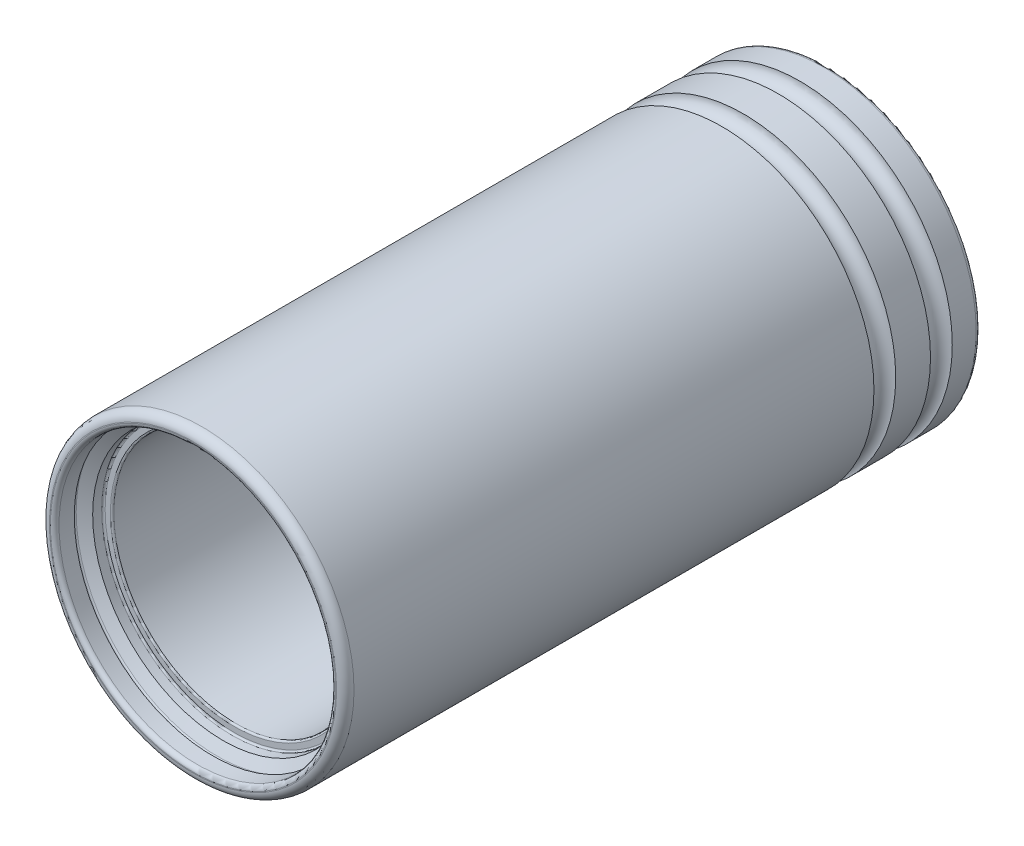
ISO-10303-21;
HEADER;
FILE_DESCRIPTION(('STEP AP214'),'2;1');
FILE_NAME('part.step','',(''),(''),'','','');
FILE_SCHEMA(('AUTOMOTIVE_DESIGN { 1 0 10303 214 1 1 1 1 }'));
ENDSEC;
DATA;
#1=APPLICATION_CONTEXT('core data for automotive mechanical design processes');
#2=APPLICATION_PROTOCOL_DEFINITION('international standard','automotive_design',2000,#1);
#3=PRODUCT_CONTEXT('',#1,'mechanical');
#4=PRODUCT('Part','Part','',(#3));
#5=PRODUCT_RELATED_PRODUCT_CATEGORY('part','',(#4));
#6=PRODUCT_DEFINITION_FORMATION('','',#4);
#7=PRODUCT_DEFINITION_CONTEXT('part definition',#1,'design');
#8=PRODUCT_DEFINITION('design','',#6,#7);
#9=PRODUCT_DEFINITION_SHAPE('','',#8);
#10=(LENGTH_UNIT() NAMED_UNIT(*) SI_UNIT(.MILLI.,.METRE.));
#11=(NAMED_UNIT(*) PLANE_ANGLE_UNIT() SI_UNIT($,.RADIAN.));
#12=(NAMED_UNIT(*) SI_UNIT($,.STERADIAN.) SOLID_ANGLE_UNIT());
#13=UNCERTAINTY_MEASURE_WITH_UNIT(LENGTH_MEASURE(1.E-05),#10,'distance_accuracy_value','');
#14=(GEOMETRIC_REPRESENTATION_CONTEXT(3) GLOBAL_UNCERTAINTY_ASSIGNED_CONTEXT((#13)) GLOBAL_UNIT_ASSIGNED_CONTEXT((#10,
#11,#12)) REPRESENTATION_CONTEXT('',''));
#15=CARTESIAN_POINT('',(0.,0.,0.));
#16=DIRECTION('',(0.,0.,1.));
#17=DIRECTION('',(1.,0.,0.));
#18=AXIS2_PLACEMENT_3D('',#15,#16,#17);
#19=CARTESIAN_POINT('',(0.,0.,-73.));
#20=DIRECTION('',(0.,0.,1.));
#21=DIRECTION('',(1.,0.,0.));
#22=AXIS2_PLACEMENT_3D('',#19,#20,#21);
#23=CYLINDRICAL_SURFACE('',#22,17.5);
#24=CARTESIAN_POINT('',(0.,0.,-72.5));
#25=DIRECTION('',(0.,0.,1.));
#26=DIRECTION('',(1.,0.,0.));
#27=AXIS2_PLACEMENT_3D('',#24,#25,#26);
#28=CIRCLE('',#27,17.5);
#29=CARTESIAN_POINT('',(17.5,0.,-72.5));
#30=VERTEX_POINT('',#29);
#31=EDGE_CURVE('E155',#30,#30,#28,.T.);
#32=ORIENTED_EDGE('',*,*,#31,.T.);
#33=EDGE_LOOP('',(#32));
#34=FACE_BOUND('',#33,.T.);
#35=CARTESIAN_POINT('',(0.,0.,-69.75));
#36=DIRECTION('',(0.,0.,1.));
#37=DIRECTION('',(1.,0.,0.));
#38=AXIS2_PLACEMENT_3D('',#35,#36,#37);
#39=CIRCLE('',#38,17.5);
#40=CARTESIAN_POINT('',(17.5,0.,-69.75));
#41=VERTEX_POINT('',#40);
#42=EDGE_CURVE('E57',#41,#41,#39,.F.);
#43=ORIENTED_EDGE('',*,*,#42,.T.);
#44=EDGE_LOOP('',(#43));
#45=FACE_BOUND('',#44,.T.);
#46=ADVANCED_FACE('F32',(#34,#45),#23,.T.);
#47=CARTESIAN_POINT('',(0.,0.,-1.));
#48=DIRECTION('',(0.,0.,1.));
#49=DIRECTION('',(1.,0.,0.));
#50=AXIS2_PLACEMENT_3D('',#47,#48,#49);
#51=CIRCLE('',#50,17.5);
#52=CARTESIAN_POINT('',(17.5,0.,-1.));
#53=VERTEX_POINT('',#52);
#54=EDGE_CURVE('E167',#53,#53,#51,.F.);
#55=ORIENTED_EDGE('',*,*,#54,.T.);
#56=EDGE_LOOP('',(#55));
#57=FACE_BOUND('',#56,.T.);
#58=CARTESIAN_POINT('',(0.,0.,-60.75));
#59=DIRECTION('',(0.,0.,-1.));
#60=DIRECTION('',(-1.,0.,0.));
#61=AXIS2_PLACEMENT_3D('',#58,#59,#60);
#62=CIRCLE('',#61,17.5);
#63=CARTESIAN_POINT('',(-17.5,0.,-60.75));
#64=VERTEX_POINT('',#63);
#65=EDGE_CURVE('E60',#64,#64,#62,.F.);
#66=ORIENTED_EDGE('',*,*,#65,.T.);
#67=EDGE_LOOP('',(#66));
#68=FACE_BOUND('',#67,.T.);
#69=ADVANCED_FACE('F221',(#57,#68),#23,.T.);
#70=CARTESIAN_POINT('',(0.,0.,-73.));
#71=DIRECTION('',(0.,0.,1.));
#72=DIRECTION('',(1.,0.,0.));
#73=AXIS2_PLACEMENT_3D('',#70,#71,#72);
#74=PLANE('',#73);
#75=CARTESIAN_POINT('',(0.,0.,-73.));
#76=DIRECTION('',(0.,0.,1.));
#77=DIRECTION('',(1.,0.,0.));
#78=AXIS2_PLACEMENT_3D('',#75,#76,#77);
#79=CIRCLE('',#78,17.);
#80=CARTESIAN_POINT('',(17.,0.,-73.));
#81=VERTEX_POINT('',#80);
#82=EDGE_CURVE('E161',#81,#81,#79,.F.);
#83=ORIENTED_EDGE('',*,*,#82,.T.);
#84=EDGE_LOOP('',(#83));
#85=FACE_BOUND('',#84,.T.);
#86=CARTESIAN_POINT('',(0.,0.,-73.));
#87=DIRECTION('',(0.,0.,-1.));
#88=DIRECTION('',(-1.,0.,0.));
#89=AXIS2_PLACEMENT_3D('',#86,#87,#88);
#90=CIRCLE('',#89,15.75);
#91=CARTESIAN_POINT('',(-15.75,0.,-73.));
#92=VERTEX_POINT('',#91);
#93=EDGE_CURVE('E56',#92,#92,#90,.T.);
#94=ORIENTED_EDGE('',*,*,#93,.F.);
#95=EDGE_LOOP('',(#94));
#96=FACE_BOUND('',#95,.T.);
#97=ADVANCED_FACE('F218',(#85,#96),#74,.F.);
#98=CARTESIAN_POINT('',(0.,0.,-73.));
#99=DIRECTION('',(0.,0.,1.));
#100=DIRECTION('',(1.,0.,0.));
#101=AXIS2_PLACEMENT_3D('',#98,#99,#100);
#102=CIRCLE('',#101,11.25);
#103=CARTESIAN_POINT('',(11.25,0.,-73.));
#104=VERTEX_POINT('',#103);
#105=EDGE_CURVE('E158',#104,#104,#102,.T.);
#106=ORIENTED_EDGE('',*,*,#105,.T.);
#107=EDGE_LOOP('',(#106));
#108=FACE_BOUND('',#107,.T.);
#109=CARTESIAN_POINT('',(0.,0.,-73.));
#110=DIRECTION('',(0.,0.,-1.));
#111=DIRECTION('',(-1.,0.,0.));
#112=AXIS2_PLACEMENT_3D('',#109,#110,#111);
#113=CIRCLE('',#112,13.25);
#114=CARTESIAN_POINT('',(-13.25,0.,-73.));
#115=VERTEX_POINT('',#114);
#116=EDGE_CURVE('E172',#115,#115,#113,.T.);
#117=ORIENTED_EDGE('',*,*,#116,.T.);
#118=EDGE_LOOP('',(#117));
#119=FACE_BOUND('',#118,.T.);
#120=ADVANCED_FACE('F220',(#108,#119),#74,.F.);
#121=CARTESIAN_POINT('',(0.,0.,-73.));
#122=DIRECTION('',(0.,0.,-1.));
#123=DIRECTION('',(-1.,0.,0.));
#124=AXIS2_PLACEMENT_3D('',#121,#122,#123);
#125=CYLINDRICAL_SURFACE('',#124,15.);
#126=CARTESIAN_POINT('',(0.,0.,-4.5));
#127=DIRECTION('',(0.,0.,-1.));
#128=DIRECTION('',(-1.,0.,0.));
#129=AXIS2_PLACEMENT_3D('',#126,#127,#128);
#130=CIRCLE('',#129,15.);
#131=CARTESIAN_POINT('',(-15.,0.,-4.5));
#132=VERTEX_POINT('',#131);
#133=EDGE_CURVE('E193',#132,#132,#130,.T.);
#134=ORIENTED_EDGE('',*,*,#133,.T.);
#135=EDGE_LOOP('',(#134));
#136=FACE_BOUND('',#135,.T.);
#137=CARTESIAN_POINT('',(0.,0.,-3.46602540378444));
#138=DIRECTION('',(0.,0.,1.));
#139=DIRECTION('',(1.,0.,0.));
#140=AXIS2_PLACEMENT_3D('',#137,#138,#139);
#141=CIRCLE('',#140,15.);
#142=CARTESIAN_POINT('',(15.,0.,-3.46602540378444));
#143=VERTEX_POINT('',#142);
#144=EDGE_CURVE('E171',#143,#143,#141,.T.);
#145=ORIENTED_EDGE('',*,*,#144,.T.);
#146=EDGE_LOOP('',(#145));
#147=FACE_BOUND('',#146,.T.);
#148=ADVANCED_FACE('F228',(#136,#147),#125,.F.);
#149=CARTESIAN_POINT('',(0.,0.,0.));
#150=DIRECTION('',(0.,0.,1.));
#151=DIRECTION('',(1.,0.,0.));
#152=AXIS2_PLACEMENT_3D('',#149,#150,#151);
#153=PLANE('',#152);
#154=CARTESIAN_POINT('',(0.,0.,0.));
#155=DIRECTION('',(0.,0.,1.));
#156=DIRECTION('',(1.,0.,0.));
#157=AXIS2_PLACEMENT_3D('',#154,#155,#156);
#158=CIRCLE('',#157,16.4);
#159=CARTESIAN_POINT('',(16.4,0.,0.));
#160=VERTEX_POINT('',#159);
#161=EDGE_CURVE('E10',#160,#160,#158,.F.);
#162=ORIENTED_EDGE('',*,*,#161,.T.);
#163=EDGE_LOOP('',(#162));
#164=FACE_BOUND('',#163,.T.);
#165=CARTESIAN_POINT('',(0.,0.,0.));
#166=DIRECTION('',(0.,0.,1.));
#167=DIRECTION('',(1.,0.,0.));
#168=AXIS2_PLACEMENT_3D('',#165,#166,#167);
#169=CIRCLE('',#168,16.5);
#170=CARTESIAN_POINT('',(16.5,0.,0.));
#171=VERTEX_POINT('',#170);
#172=EDGE_CURVE('E175',#171,#171,#169,.T.);
#173=ORIENTED_EDGE('',*,*,#172,.T.);
#174=EDGE_LOOP('',(#173));
#175=FACE_BOUND('',#174,.T.);
#176=ADVANCED_FACE('F369',(#164,#175),#153,.T.);
#177=CARTESIAN_POINT('',(0.,15.,-4.7));
#178=DIRECTION('',(0.,0.,-1.));
#179=DIRECTION('',(-1.,0.,0.));
#180=AXIS2_PLACEMENT_3D('',#177,#178,#179);
#181=PLANE('',#180);
#182=CARTESIAN_POINT('',(0.,0.,-4.7));
#183=DIRECTION('',(0.,0.,-1.));
#184=DIRECTION('',(-1.,0.,0.));
#185=AXIS2_PLACEMENT_3D('',#182,#183,#184);
#186=CIRCLE('',#185,14.2);
#187=CARTESIAN_POINT('',(-14.2,0.,-4.7));
#188=VERTEX_POINT('',#187);
#189=EDGE_CURVE('E68',#188,#188,#186,.T.);
#190=ORIENTED_EDGE('',*,*,#189,.T.);
#191=EDGE_LOOP('',(#190));
#192=FACE_BOUND('',#191,.T.);
#193=CARTESIAN_POINT('',(0.,0.,-4.7));
#194=DIRECTION('',(0.,0.,-1.));
#195=DIRECTION('',(-1.,0.,0.));
#196=AXIS2_PLACEMENT_3D('',#193,#194,#195);
#197=CIRCLE('',#196,14.8);
#198=CARTESIAN_POINT('',(-14.8,0.,-4.7));
#199=VERTEX_POINT('',#198);
#200=EDGE_CURVE('E190',#199,#199,#197,.F.);
#201=ORIENTED_EDGE('',*,*,#200,.T.);
#202=EDGE_LOOP('',(#201));
#203=FACE_BOUND('',#202,.T.);
#204=ADVANCED_FACE('F366',(#192,#203),#181,.F.);
#205=CARTESIAN_POINT('',(0.,0.,-73.));
#206=DIRECTION('',(0.,0.,-1.));
#207=DIRECTION('',(-1.,0.,0.));
#208=AXIS2_PLACEMENT_3D('',#205,#206,#207);
#209=CYLINDRICAL_SURFACE('',#208,14.);
#210=CARTESIAN_POINT('',(0.,0.,-4.9));
#211=DIRECTION('',(0.,0.,-1.));
#212=DIRECTION('',(-1.,0.,0.));
#213=AXIS2_PLACEMENT_3D('',#210,#211,#212);
#214=CIRCLE('',#213,14.);
#215=CARTESIAN_POINT('',(-14.,0.,-4.9));
#216=VERTEX_POINT('',#215);
#217=EDGE_CURVE('E52',#216,#216,#214,.F.);
#218=ORIENTED_EDGE('',*,*,#217,.T.);
#219=EDGE_LOOP('',(#218));
#220=FACE_BOUND('',#219,.T.);
#221=CARTESIAN_POINT('',(0.,0.,-22.3));
#222=DIRECTION('',(0.,0.,-1.));
#223=DIRECTION('',(-1.,0.,0.));
#224=AXIS2_PLACEMENT_3D('',#221,#222,#223);
#225=CIRCLE('',#224,14.);
#226=CARTESIAN_POINT('',(-14.,0.,-22.3));
#227=VERTEX_POINT('',#226);
#228=EDGE_CURVE('E181',#227,#227,#225,.T.);
#229=ORIENTED_EDGE('',*,*,#228,.T.);
#230=EDGE_LOOP('',(#229));
#231=FACE_BOUND('',#230,.T.);
#232=ADVANCED_FACE('F362',(#220,#231),#209,.F.);
#233=CARTESIAN_POINT('',(0.,14.,-23.3));
#234=DIRECTION('',(0.,0.,-1.));
#235=DIRECTION('',(-1.,0.,0.));
#236=AXIS2_PLACEMENT_3D('',#233,#234,#235);
#237=PLANE('',#236);
#238=CARTESIAN_POINT('',(0.,0.,-23.3));
#239=DIRECTION('',(0.,0.,-1.));
#240=DIRECTION('',(-1.,0.,0.));
#241=AXIS2_PLACEMENT_3D('',#238,#239,#240);
#242=CIRCLE('',#241,11.3871413639209);
#243=CARTESIAN_POINT('',(-11.3871413639209,0.,-23.3));
#244=VERTEX_POINT('',#243);
#245=EDGE_CURVE('E131',#244,#244,#242,.T.);
#246=ORIENTED_EDGE('',*,*,#245,.T.);
#247=EDGE_LOOP('',(#246));
#248=FACE_BOUND('',#247,.T.);
#249=CARTESIAN_POINT('',(0.,0.,-23.3));
#250=DIRECTION('',(0.,0.,-1.));
#251=DIRECTION('',(-1.,0.,0.));
#252=AXIS2_PLACEMENT_3D('',#249,#250,#251);
#253=CIRCLE('',#252,13.);
#254=CARTESIAN_POINT('',(-13.,0.,-23.3));
#255=VERTEX_POINT('',#254);
#256=EDGE_CURVE('E178',#255,#255,#253,.F.);
#257=ORIENTED_EDGE('',*,*,#256,.T.);
#258=EDGE_LOOP('',(#257));
#259=FACE_BOUND('',#258,.T.);
#260=ADVANCED_FACE('F358',(#248,#259),#237,.F.);
#261=CARTESIAN_POINT('',(0.,0.,-29.1000696423482));
#262=DIRECTION('',(0.,0.,1.));
#263=DIRECTION('',(1.,0.,0.));
#264=AXIS2_PLACEMENT_3D('',#261,#262,#263);
#265=CONICAL_SURFACE('',#264,9.5,0.253072741539171);
#266=CARTESIAN_POINT('',(0.,0.,-29.0384876743216));
#267=DIRECTION('',(0.,0.,-1.));
#268=DIRECTION('',(-1.,0.,0.));
#269=AXIS2_PLACEMENT_3D('',#266,#267,#268);
#270=CIRCLE('',#269,9.51592617981095);
#271=CARTESIAN_POINT('',(-9.51592617981095,0.,-29.0384876743216));
#272=VERTEX_POINT('',#271);
#273=EDGE_CURVE('E137',#272,#272,#270,.T.);
#274=ORIENTED_EDGE('',*,*,#273,.T.);
#275=EDGE_LOOP('',(#274));
#276=FACE_BOUND('',#275,.T.);
#277=CARTESIAN_POINT('',(0.,0.,-23.6748099979728));
#278=DIRECTION('',(0.,0.,-1.));
#279=DIRECTION('',(-1.,0.,0.));
#280=AXIS2_PLACEMENT_3D('',#277,#278,#279);
#281=CIRCLE('',#280,10.9030675437318);
#282=CARTESIAN_POINT('',(-10.9030675437318,0.,-23.6748099979728));
#283=VERTEX_POINT('',#282);
#284=EDGE_CURVE('E140',#283,#283,#281,.F.);
#285=ORIENTED_EDGE('',*,*,#284,.T.);
#286=EDGE_LOOP('',(#285));
#287=FACE_BOUND('',#286,.T.);
#288=ADVANCED_FACE('F354',(#276,#287),#265,.F.);
#289=CARTESIAN_POINT('',(0.,0.,-73.));
#290=DIRECTION('',(0.,0.,-1.));
#291=DIRECTION('',(-1.,0.,0.));
#292=AXIS2_PLACEMENT_3D('',#289,#290,#291);
#293=CYLINDRICAL_SURFACE('',#292,9.5);
#294=CARTESIAN_POINT('',(0.,0.,-30.6));
#295=DIRECTION('',(0.,0.,1.));
#296=DIRECTION('',(1.,0.,0.));
#297=AXIS2_PLACEMENT_3D('',#294,#295,#296);
#298=CIRCLE('',#297,9.5);
#299=CARTESIAN_POINT('',(9.5,0.,-30.6));
#300=VERTEX_POINT('',#299);
#301=EDGE_CURVE('E98',#300,#300,#298,.F.);
#302=ORIENTED_EDGE('',*,*,#301,.T.);
#303=EDGE_LOOP('',(#302));
#304=FACE_BOUND('',#303,.T.);
#305=CARTESIAN_POINT('',(0.,0.,-29.1636776763488));
#306=DIRECTION('',(0.,0.,1.));
#307=DIRECTION('',(1.,0.,0.));
#308=AXIS2_PLACEMENT_3D('',#305,#306,#307);
#309=CIRCLE('',#308,9.5);
#310=CARTESIAN_POINT('',(9.5,0.,-29.1636776763488));
#311=VERTEX_POINT('',#310);
#312=EDGE_CURVE('E134',#311,#311,#309,.T.);
#313=ORIENTED_EDGE('',*,*,#312,.T.);
#314=EDGE_LOOP('',(#313));
#315=FACE_BOUND('',#314,.T.);
#316=ADVANCED_FACE('F350',(#304,#315),#293,.F.);
#317=CARTESIAN_POINT('',(0.,9.5,-30.8));
#318=DIRECTION('',(0.,0.,1.));
#319=DIRECTION('',(1.,0.,0.));
#320=AXIS2_PLACEMENT_3D('',#317,#318,#319);
#321=PLANE('',#320);
#322=CARTESIAN_POINT('',(0.,0.,-30.8));
#323=DIRECTION('',(0.,0.,1.));
#324=DIRECTION('',(1.,0.,0.));
#325=AXIS2_PLACEMENT_3D('',#322,#323,#324);
#326=CIRCLE('',#325,9.7);
#327=CARTESIAN_POINT('',(9.7,0.,-30.8));
#328=VERTEX_POINT('',#327);
#329=EDGE_CURVE('E95',#328,#328,#326,.T.);
#330=ORIENTED_EDGE('',*,*,#329,.T.);
#331=EDGE_LOOP('',(#330));
#332=FACE_BOUND('',#331,.T.);
#333=CARTESIAN_POINT('',(0.,0.,-30.8));
#334=DIRECTION('',(0.,0.,1.));
#335=DIRECTION('',(1.,0.,0.));
#336=AXIS2_PLACEMENT_3D('',#333,#334,#335);
#337=CIRCLE('',#336,10.);
#338=CARTESIAN_POINT('',(10.,0.,-30.8));
#339=VERTEX_POINT('',#338);
#340=EDGE_CURVE('E119',#339,#339,#337,.F.);
#341=ORIENTED_EDGE('',*,*,#340,.T.);
#342=EDGE_LOOP('',(#341));
#343=FACE_BOUND('',#342,.T.);
#344=ADVANCED_FACE('F346',(#332,#343),#321,.F.);
#345=CARTESIAN_POINT('',(0.,0.,-73.));
#346=DIRECTION('',(0.,0.,-1.));
#347=DIRECTION('',(-1.,0.,0.));
#348=AXIS2_PLACEMENT_3D('',#345,#346,#347);
#349=CYLINDRICAL_SURFACE('',#348,10.1);
#350=CARTESIAN_POINT('',(0.,0.,-31.942264973081));
#351=DIRECTION('',(0.,0.,-1.));
#352=DIRECTION('',(-1.,0.,0.));
#353=AXIS2_PLACEMENT_3D('',#350,#351,#352);
#354=CIRCLE('',#353,10.1);
#355=CARTESIAN_POINT('',(-10.1,0.,-31.942264973081));
#356=VERTEX_POINT('',#355);
#357=EDGE_CURVE('E125',#356,#356,#354,.T.);
#358=ORIENTED_EDGE('',*,*,#357,.T.);
#359=EDGE_LOOP('',(#358));
#360=FACE_BOUND('',#359,.T.);
#361=CARTESIAN_POINT('',(0.,0.,-30.9));
#362=DIRECTION('',(0.,0.,1.));
#363=DIRECTION('',(1.,0.,0.));
#364=AXIS2_PLACEMENT_3D('',#361,#362,#363);
#365=CIRCLE('',#364,10.1);
#366=CARTESIAN_POINT('',(10.1,0.,-30.9));
#367=VERTEX_POINT('',#366);
#368=EDGE_CURVE('E128',#367,#367,#365,.T.);
#369=ORIENTED_EDGE('',*,*,#368,.T.);
#370=EDGE_LOOP('',(#369));
#371=FACE_BOUND('',#370,.T.);
#372=ADVANCED_FACE('F342',(#360,#371),#349,.F.);
#373=CARTESIAN_POINT('',(0.,0.,-32.3464101615138));
#374=DIRECTION('',(0.,0.,1.));
#375=DIRECTION('',(1.,0.,0.));
#376=AXIS2_PLACEMENT_3D('',#373,#374,#375);
#377=CONICAL_SURFACE('',#376,9.5,1.04719755119659);
#378=CARTESIAN_POINT('',(0.,0.,-32.2886751345948));
#379=DIRECTION('',(0.,0.,-1.));
#380=DIRECTION('',(-1.,0.,0.));
#381=AXIS2_PLACEMENT_3D('',#378,#379,#380);
#382=CIRCLE('',#381,9.6);
#383=CARTESIAN_POINT('',(-9.6,0.,-32.2886751345948));
#384=VERTEX_POINT('',#383);
#385=EDGE_CURVE('E104',#384,#384,#382,.T.);
#386=ORIENTED_EDGE('',*,*,#385,.T.);
#387=EDGE_LOOP('',(#386));
#388=FACE_BOUND('',#387,.T.);
#389=CARTESIAN_POINT('',(0.,0.,-32.0288675134595));
#390=DIRECTION('',(0.,0.,1.));
#391=DIRECTION('',(1.,0.,0.));
#392=AXIS2_PLACEMENT_3D('',#389,#390,#391);
#393=CIRCLE('',#392,10.05);
#394=CARTESIAN_POINT('',(10.05,0.,-32.0288675134595));
#395=VERTEX_POINT('',#394);
#396=EDGE_CURVE('E122',#395,#395,#393,.T.);
#397=ORIENTED_EDGE('',*,*,#396,.T.);
#398=EDGE_LOOP('',(#397));
#399=FACE_BOUND('',#398,.T.);
#400=ADVANCED_FACE('F338',(#388,#399),#377,.F.);
#401=CARTESIAN_POINT('',(0.,0.,-73.));
#402=DIRECTION('',(0.,0.,-1.));
#403=DIRECTION('',(-1.,0.,0.));
#404=AXIS2_PLACEMENT_3D('',#401,#402,#403);
#405=CYLINDRICAL_SURFACE('',#404,9.5);
#406=CARTESIAN_POINT('',(0.,0.,-32.4618802153517));
#407=DIRECTION('',(0.,0.,1.));
#408=DIRECTION('',(1.,0.,0.));
#409=AXIS2_PLACEMENT_3D('',#406,#407,#408);
#410=CIRCLE('',#409,9.5);
#411=CARTESIAN_POINT('',(9.5,0.,-32.4618802153517));
#412=VERTEX_POINT('',#411);
#413=EDGE_CURVE('E101',#412,#412,#410,.T.);
#414=ORIENTED_EDGE('',*,*,#413,.T.);
#415=EDGE_LOOP('',(#414));
#416=FACE_BOUND('',#415,.T.);
#417=CARTESIAN_POINT('',(0.,0.,-46.));
#418=DIRECTION('',(0.,0.,-1.));
#419=DIRECTION('',(-1.,0.,0.));
#420=AXIS2_PLACEMENT_3D('',#417,#418,#419);
#421=CIRCLE('',#420,9.5);
#422=CARTESIAN_POINT('',(-9.5,0.,-46.));
#423=VERTEX_POINT('',#422);
#424=EDGE_CURVE('E196',#423,#423,#421,.T.);
#425=ORIENTED_EDGE('',*,*,#424,.T.);
#426=EDGE_LOOP('',(#425));
#427=FACE_BOUND('',#426,.T.);
#428=ADVANCED_FACE('F334',(#416,#427),#405,.F.);
#429=CARTESIAN_POINT('',(0.,9.5,-46.));
#430=DIRECTION('',(0.,0.,-1.));
#431=DIRECTION('',(-1.,0.,0.));
#432=AXIS2_PLACEMENT_3D('',#429,#430,#431);
#433=PLANE('',#432);
#434=ORIENTED_EDGE('',*,*,#424,.F.);
#435=EDGE_LOOP('',(#434));
#436=FACE_BOUND('',#435,.T.);
#437=CARTESIAN_POINT('',(0.,0.,-46.));
#438=DIRECTION('',(0.,0.,-1.));
#439=DIRECTION('',(-1.,0.,0.));
#440=AXIS2_PLACEMENT_3D('',#437,#438,#439);
#441=CIRCLE('',#440,7.5);
#442=CARTESIAN_POINT('',(-7.5,0.,-46.));
#443=VERTEX_POINT('',#442);
#444=EDGE_CURVE('E199',#443,#443,#441,.T.);
#445=ORIENTED_EDGE('',*,*,#444,.T.);
#446=EDGE_LOOP('',(#445));
#447=FACE_BOUND('',#446,.T.);
#448=ADVANCED_FACE('F330',(#436,#447),#433,.F.);
#449=CARTESIAN_POINT('',(0.,0.,-46.5235932611565));
#450=DIRECTION('',(0.,0.,1.));
#451=DIRECTION('',(1.,0.,0.));
#452=AXIS2_PLACEMENT_3D('',#449,#450,#451);
#453=CONICAL_SURFACE('',#452,5.5,1.3147461371813);
#454=CARTESIAN_POINT('',(0.,0.,-46.425846449452));
#455=DIRECTION('',(0.,0.,-1.));
#456=DIRECTION('',(-1.,0.,0.));
#457=AXIS2_PLACEMENT_3D('',#454,#455,#456);
#458=CIRCLE('',#457,5.87336925035516);
#459=CARTESIAN_POINT('',(-5.87336925035516,0.,-46.425846449452));
#460=VERTEX_POINT('',#459);
#461=EDGE_CURVE('E143',#460,#460,#458,.T.);
#462=ORIENTED_EDGE('',*,*,#461,.T.);
#463=EDGE_LOOP('',(#462));
#464=FACE_BOUND('',#463,.T.);
#465=ORIENTED_EDGE('',*,*,#444,.F.);
#466=EDGE_LOOP('',(#465));
#467=FACE_BOUND('',#466,.T.);
#468=ADVANCED_FACE('F326',(#464,#467),#453,.F.);
#469=CARTESIAN_POINT('',(0.,0.,-73.));
#470=DIRECTION('',(0.,0.,-1.));
#471=DIRECTION('',(-1.,0.,0.));
#472=AXIS2_PLACEMENT_3D('',#469,#470,#471);
#473=CYLINDRICAL_SURFACE('',#472,5.5);
#474=CARTESIAN_POINT('',(0.,0.,-49.5));
#475=DIRECTION('',(0.,0.,1.));
#476=DIRECTION('',(1.,0.,0.));
#477=AXIS2_PLACEMENT_3D('',#474,#475,#476);
#478=CIRCLE('',#477,5.5);
#479=CARTESIAN_POINT('',(5.5,0.,-49.5));
#480=VERTEX_POINT('',#479);
#481=EDGE_CURVE('E149',#480,#480,#478,.F.);
#482=ORIENTED_EDGE('',*,*,#481,.T.);
#483=EDGE_LOOP('',(#482));
#484=FACE_BOUND('',#483,.T.);
#485=CARTESIAN_POINT('',(0.,0.,-46.909545377758));
#486=DIRECTION('',(0.,0.,1.));
#487=DIRECTION('',(1.,0.,0.));
#488=AXIS2_PLACEMENT_3D('',#485,#486,#487);
#489=CIRCLE('',#488,5.5);
#490=CARTESIAN_POINT('',(5.5,0.,-46.909545377758));
#491=VERTEX_POINT('',#490);
#492=EDGE_CURVE('E152',#491,#491,#489,.T.);
#493=ORIENTED_EDGE('',*,*,#492,.T.);
#494=EDGE_LOOP('',(#493));
#495=FACE_BOUND('',#494,.T.);
#496=ADVANCED_FACE('F322',(#484,#495),#473,.F.);
#497=CARTESIAN_POINT('',(0.,5.5,-50.));
#498=DIRECTION('',(0.,0.,1.));
#499=DIRECTION('',(1.,0.,0.));
#500=AXIS2_PLACEMENT_3D('',#497,#498,#499);
#501=PLANE('',#500);
#502=CARTESIAN_POINT('',(0.,0.,-50.));
#503=DIRECTION('',(0.,0.,1.));
#504=DIRECTION('',(1.,0.,0.));
#505=AXIS2_PLACEMENT_3D('',#502,#503,#504);
#506=CIRCLE('',#505,9.3);
#507=CARTESIAN_POINT('',(9.3,0.,-50.));
#508=VERTEX_POINT('',#507);
#509=EDGE_CURVE('E47',#508,#508,#506,.F.);
#510=ORIENTED_EDGE('',*,*,#509,.T.);
#511=EDGE_LOOP('',(#510));
#512=FACE_BOUND('',#511,.T.);
#513=CARTESIAN_POINT('',(0.,0.,-50.));
#514=DIRECTION('',(0.,0.,1.));
#515=DIRECTION('',(1.,0.,0.));
#516=AXIS2_PLACEMENT_3D('',#513,#514,#515);
#517=CIRCLE('',#516,6.);
#518=CARTESIAN_POINT('',(6.,0.,-50.));
#519=VERTEX_POINT('',#518);
#520=EDGE_CURVE('E146',#519,#519,#517,.T.);
#521=ORIENTED_EDGE('',*,*,#520,.T.);
#522=EDGE_LOOP('',(#521));
#523=FACE_BOUND('',#522,.T.);
#524=ADVANCED_FACE('F318',(#512,#523),#501,.F.);
#525=CARTESIAN_POINT('',(0.,0.,-73.));
#526=DIRECTION('',(0.,0.,-1.));
#527=DIRECTION('',(-1.,0.,0.));
#528=AXIS2_PLACEMENT_3D('',#525,#526,#527);
#529=CYLINDRICAL_SURFACE('',#528,9.5);
#530=CARTESIAN_POINT('',(0.,0.,-50.2));
#531=DIRECTION('',(0.,0.,1.));
#532=DIRECTION('',(1.,0.,0.));
#533=AXIS2_PLACEMENT_3D('',#530,#531,#532);
#534=CIRCLE('',#533,9.5);
#535=CARTESIAN_POINT('',(9.5,0.,-50.2));
#536=VERTEX_POINT('',#535);
#537=EDGE_CURVE('E43',#536,#536,#534,.T.);
#538=ORIENTED_EDGE('',*,*,#537,.T.);
#539=EDGE_LOOP('',(#538));
#540=FACE_BOUND('',#539,.T.);
#541=CARTESIAN_POINT('',(0.,0.,-53.8));
#542=DIRECTION('',(0.,0.,-1.));
#543=DIRECTION('',(-1.,0.,0.));
#544=AXIS2_PLACEMENT_3D('',#541,#542,#543);
#545=CIRCLE('',#544,9.5);
#546=CARTESIAN_POINT('',(-9.5,0.,-53.8));
#547=VERTEX_POINT('',#546);
#548=EDGE_CURVE('E202',#547,#547,#545,.T.);
#549=ORIENTED_EDGE('',*,*,#548,.T.);
#550=EDGE_LOOP('',(#549));
#551=FACE_BOUND('',#550,.T.);
#552=ADVANCED_FACE('F314',(#540,#551),#529,.F.);
#553=CARTESIAN_POINT('',(0.,0.,-54.4));
#554=DIRECTION('',(0.,0.,-1.));
#555=DIRECTION('',(-1.,0.,0.));
#556=AXIS2_PLACEMENT_3D('',#553,#554,#555);
#557=TOROIDAL_SURFACE('',#556,9.5,0.600000000000003);
#558=ORIENTED_EDGE('',*,*,#548,.F.);
#559=EDGE_LOOP('',(#558));
#560=FACE_BOUND('',#559,.T.);
#561=CARTESIAN_POINT('',(0.,0.,-55.));
#562=DIRECTION('',(0.,0.,-1.));
#563=DIRECTION('',(-1.,0.,0.));
#564=AXIS2_PLACEMENT_3D('',#561,#562,#563);
#565=CIRCLE('',#564,9.5);
#566=CARTESIAN_POINT('',(-9.5,0.,-55.));
#567=VERTEX_POINT('',#566);
#568=EDGE_CURVE('E205',#567,#567,#565,.T.);
#569=ORIENTED_EDGE('',*,*,#568,.T.);
#570=EDGE_LOOP('',(#569));
#571=FACE_BOUND('',#570,.T.);
#572=ADVANCED_FACE('F310',(#560,#571),#557,.F.);
#573=CARTESIAN_POINT('',(0.,0.,-73.));
#574=DIRECTION('',(0.,0.,-1.));
#575=DIRECTION('',(-1.,0.,0.));
#576=AXIS2_PLACEMENT_3D('',#573,#574,#575);
#577=CYLINDRICAL_SURFACE('',#576,9.5);
#578=CARTESIAN_POINT('',(0.,0.,-56.3));
#579=DIRECTION('',(0.,0.,1.));
#580=DIRECTION('',(1.,0.,0.));
#581=AXIS2_PLACEMENT_3D('',#578,#579,#580);
#582=CIRCLE('',#581,9.5);
#583=CARTESIAN_POINT('',(9.5,0.,-56.3));
#584=VERTEX_POINT('',#583);
#585=EDGE_CURVE('E71',#584,#584,#582,.F.);
#586=ORIENTED_EDGE('',*,*,#585,.T.);
#587=EDGE_LOOP('',(#586));
#588=FACE_BOUND('',#587,.T.);
#589=ORIENTED_EDGE('',*,*,#568,.F.);
#590=EDGE_LOOP('',(#589));
#591=FACE_BOUND('',#590,.T.);
#592=ADVANCED_FACE('F306',(#588,#591),#577,.F.);
#593=CARTESIAN_POINT('',(0.,9.5,-56.5));
#594=DIRECTION('',(0.,0.,1.));
#595=DIRECTION('',(1.,0.,0.));
#596=AXIS2_PLACEMENT_3D('',#593,#594,#595);
#597=PLANE('',#596);
#598=CARTESIAN_POINT('',(0.,0.,-56.5));
#599=DIRECTION('',(0.,0.,1.));
#600=DIRECTION('',(1.,0.,0.));
#601=AXIS2_PLACEMENT_3D('',#598,#599,#600);
#602=CIRCLE('',#601,10.55);
#603=CARTESIAN_POINT('',(10.55,0.,-56.5));
#604=VERTEX_POINT('',#603);
#605=EDGE_CURVE('E77',#604,#604,#602,.F.);
#606=ORIENTED_EDGE('',*,*,#605,.T.);
#607=EDGE_LOOP('',(#606));
#608=FACE_BOUND('',#607,.T.);
#609=CARTESIAN_POINT('',(0.,0.,-56.5));
#610=DIRECTION('',(0.,0.,1.));
#611=DIRECTION('',(1.,0.,0.));
#612=AXIS2_PLACEMENT_3D('',#609,#610,#611);
#613=CIRCLE('',#612,9.7);
#614=CARTESIAN_POINT('',(9.7,0.,-56.5));
#615=VERTEX_POINT('',#614);
#616=EDGE_CURVE('E80',#615,#615,#613,.T.);
#617=ORIENTED_EDGE('',*,*,#616,.T.);
#618=EDGE_LOOP('',(#617));
#619=FACE_BOUND('',#618,.T.);
#620=ADVANCED_FACE('F302',(#608,#619),#597,.F.);
#621=CARTESIAN_POINT('',(0.,0.,-73.));
#622=DIRECTION('',(0.,0.,-1.));
#623=DIRECTION('',(-1.,0.,0.));
#624=AXIS2_PLACEMENT_3D('',#621,#622,#623);
#625=CYLINDRICAL_SURFACE('',#624,10.75);
#626=CARTESIAN_POINT('',(0.,0.,-56.7));
#627=DIRECTION('',(0.,0.,1.));
#628=DIRECTION('',(1.,0.,0.));
#629=AXIS2_PLACEMENT_3D('',#626,#627,#628);
#630=CIRCLE('',#629,10.75);
#631=CARTESIAN_POINT('',(10.75,0.,-56.7));
#632=VERTEX_POINT('',#631);
#633=EDGE_CURVE('E74',#632,#632,#630,.T.);
#634=ORIENTED_EDGE('',*,*,#633,.T.);
#635=EDGE_LOOP('',(#634));
#636=FACE_BOUND('',#635,.T.);
#637=CARTESIAN_POINT('',(0.,0.,-67.8));
#638=DIRECTION('',(0.,0.,1.));
#639=DIRECTION('',(1.,0.,0.));
#640=AXIS2_PLACEMENT_3D('',#637,#638,#639);
#641=CIRCLE('',#640,10.75);
#642=CARTESIAN_POINT('',(10.75,0.,-67.8));
#643=VERTEX_POINT('',#642);
#644=EDGE_CURVE('E110',#643,#643,#641,.F.);
#645=ORIENTED_EDGE('',*,*,#644,.T.);
#646=EDGE_LOOP('',(#645));
#647=FACE_BOUND('',#646,.T.);
#648=ADVANCED_FACE('F298',(#636,#647),#625,.F.);
#649=CARTESIAN_POINT('',(0.,10.75,-68.));
#650=DIRECTION('',(0.,0.,1.));
#651=DIRECTION('',(1.,0.,0.));
#652=AXIS2_PLACEMENT_3D('',#649,#650,#651);
#653=PLANE('',#652);
#654=CARTESIAN_POINT('',(0.,0.,-68.));
#655=DIRECTION('',(0.,0.,1.));
#656=DIRECTION('',(1.,0.,0.));
#657=AXIS2_PLACEMENT_3D('',#654,#655,#656);
#658=CIRCLE('',#657,12.);
#659=CARTESIAN_POINT('',(12.,0.,-68.));
#660=VERTEX_POINT('',#659);
#661=EDGE_CURVE('E83',#660,#660,#658,.F.);
#662=ORIENTED_EDGE('',*,*,#661,.T.);
#663=EDGE_LOOP('',(#662));
#664=FACE_BOUND('',#663,.T.);
#665=CARTESIAN_POINT('',(0.,0.,-68.));
#666=DIRECTION('',(0.,0.,1.));
#667=DIRECTION('',(1.,0.,0.));
#668=AXIS2_PLACEMENT_3D('',#665,#666,#667);
#669=CIRCLE('',#668,10.95);
#670=CARTESIAN_POINT('',(10.95,0.,-68.));
#671=VERTEX_POINT('',#670);
#672=EDGE_CURVE('E107',#671,#671,#669,.T.);
#673=ORIENTED_EDGE('',*,*,#672,.T.);
#674=EDGE_LOOP('',(#673));
#675=FACE_BOUND('',#674,.T.);
#676=ADVANCED_FACE('F294',(#664,#675),#653,.F.);
#677=CARTESIAN_POINT('',(0.,0.,-73.));
#678=DIRECTION('',(0.,0.,-1.));
#679=DIRECTION('',(-1.,0.,0.));
#680=AXIS2_PLACEMENT_3D('',#677,#678,#679);
#681=CYLINDRICAL_SURFACE('',#680,12.4);
#682=CARTESIAN_POINT('',(0.,0.,-70.6));
#683=DIRECTION('',(0.,0.,-1.));
#684=DIRECTION('',(-1.,0.,0.));
#685=AXIS2_PLACEMENT_3D('',#682,#683,#684);
#686=CIRCLE('',#685,12.4);
#687=CARTESIAN_POINT('',(-12.4,0.,-70.6));
#688=VERTEX_POINT('',#687);
#689=EDGE_CURVE('E89',#688,#688,#686,.T.);
#690=ORIENTED_EDGE('',*,*,#689,.T.);
#691=EDGE_LOOP('',(#690));
#692=FACE_BOUND('',#691,.T.);
#693=CARTESIAN_POINT('',(0.,0.,-68.4));
#694=DIRECTION('',(0.,0.,1.));
#695=DIRECTION('',(1.,0.,0.));
#696=AXIS2_PLACEMENT_3D('',#693,#694,#695);
#697=CIRCLE('',#696,12.4);
#698=CARTESIAN_POINT('',(12.4,0.,-68.4));
#699=VERTEX_POINT('',#698);
#700=EDGE_CURVE('E92',#699,#699,#697,.T.);
#701=ORIENTED_EDGE('',*,*,#700,.T.);
#702=EDGE_LOOP('',(#701));
#703=FACE_BOUND('',#702,.T.);
#704=ADVANCED_FACE('F290',(#692,#703),#681,.F.);
#705=CARTESIAN_POINT('',(0.,12.4,-71.));
#706=DIRECTION('',(0.,0.,-1.));
#707=DIRECTION('',(-1.,0.,0.));
#708=AXIS2_PLACEMENT_3D('',#705,#706,#707);
#709=PLANE('',#708);
#710=CARTESIAN_POINT('',(0.,0.,-71.));
#711=DIRECTION('',(0.,0.,-1.));
#712=DIRECTION('',(-1.,0.,0.));
#713=AXIS2_PLACEMENT_3D('',#710,#711,#712);
#714=CIRCLE('',#713,12.);
#715=CARTESIAN_POINT('',(-12.,0.,-71.));
#716=VERTEX_POINT('',#715);
#717=EDGE_CURVE('E86',#716,#716,#714,.F.);
#718=ORIENTED_EDGE('',*,*,#717,.T.);
#719=EDGE_LOOP('',(#718));
#720=FACE_BOUND('',#719,.T.);
#721=CARTESIAN_POINT('',(0.,0.,-71.));
#722=DIRECTION('',(0.,0.,-1.));
#723=DIRECTION('',(-1.,0.,0.));
#724=AXIS2_PLACEMENT_3D('',#721,#722,#723);
#725=CIRCLE('',#724,10.95);
#726=CARTESIAN_POINT('',(-10.95,0.,-71.));
#727=VERTEX_POINT('',#726);
#728=EDGE_CURVE('E116',#727,#727,#725,.T.);
#729=ORIENTED_EDGE('',*,*,#728,.T.);
#730=EDGE_LOOP('',(#729));
#731=FACE_BOUND('',#730,.T.);
#732=ADVANCED_FACE('F286',(#720,#731),#709,.F.);
#733=CARTESIAN_POINT('',(0.,0.,-73.));
#734=DIRECTION('',(0.,0.,-1.));
#735=DIRECTION('',(-1.,0.,0.));
#736=AXIS2_PLACEMENT_3D('',#733,#734,#735);
#737=CYLINDRICAL_SURFACE('',#736,10.75);
#738=CARTESIAN_POINT('',(0.,0.,-71.2));
#739=DIRECTION('',(0.,0.,-1.));
#740=DIRECTION('',(-1.,0.,0.));
#741=AXIS2_PLACEMENT_3D('',#738,#739,#740);
#742=CIRCLE('',#741,10.75);
#743=CARTESIAN_POINT('',(-10.75,0.,-71.2));
#744=VERTEX_POINT('',#743);
#745=EDGE_CURVE('E113',#744,#744,#742,.F.);
#746=ORIENTED_EDGE('',*,*,#745,.T.);
#747=EDGE_LOOP('',(#746));
#748=FACE_BOUND('',#747,.T.);
#749=CARTESIAN_POINT('',(0.,0.,-72.5));
#750=DIRECTION('',(0.,0.,1.));
#751=DIRECTION('',(1.,0.,0.));
#752=AXIS2_PLACEMENT_3D('',#749,#750,#751);
#753=CIRCLE('',#752,10.75);
#754=CARTESIAN_POINT('',(10.75,0.,-72.5));
#755=VERTEX_POINT('',#754);
#756=EDGE_CURVE('E164',#755,#755,#753,.F.);
#757=ORIENTED_EDGE('',*,*,#756,.T.);
#758=EDGE_LOOP('',(#757));
#759=FACE_BOUND('',#758,.T.);
#760=ADVANCED_FACE('F282',(#748,#759),#737,.F.);
#761=CARTESIAN_POINT('',(0.,0.,-3.46602540378444));
#762=DIRECTION('',(0.,0.,1.));
#763=DIRECTION('',(1.,0.,0.));
#764=AXIS2_PLACEMENT_3D('',#761,#762,#763);
#765=CONICAL_SURFACE('',#764,15.,1.0471975511966);
#766=CARTESIAN_POINT('',(0.,0.,-2.77320508075689));
#767=DIRECTION('',(0.,0.,1.));
#768=DIRECTION('',(1.,0.,0.));
#769=AXIS2_PLACEMENT_3D('',#766,#767,#768);
#770=CIRCLE('',#769,16.2);
#771=CARTESIAN_POINT('',(16.2,0.,-2.77320508075689));
#772=VERTEX_POINT('',#771);
#773=EDGE_CURVE('E187',#772,#772,#770,.T.);
#774=ORIENTED_EDGE('',*,*,#773,.T.);
#775=EDGE_LOOP('',(#774));
#776=FACE_BOUND('',#775,.T.);
#777=ORIENTED_EDGE('',*,*,#144,.F.);
#778=EDGE_LOOP('',(#777));
#779=FACE_BOUND('',#778,.T.);
#780=ADVANCED_FACE('F278',(#776,#779),#765,.F.);
#781=CARTESIAN_POINT('',(0.,0.,-2.6));
#782=DIRECTION('',(0.,0.,-1.));
#783=DIRECTION('',(-1.,0.,0.));
#784=AXIS2_PLACEMENT_3D('',#781,#782,#783);
#785=CONICAL_SURFACE('',#784,16.5,1.0471975511966);
#786=CARTESIAN_POINT('',(0.,0.,-2.25358983848622));
#787=DIRECTION('',(0.,0.,-1.));
#788=DIRECTION('',(-1.,0.,0.));
#789=AXIS2_PLACEMENT_3D('',#786,#787,#788);
#790=CIRCLE('',#789,15.9);
#791=CARTESIAN_POINT('',(-15.9,0.,-2.25358983848622));
#792=VERTEX_POINT('',#791);
#793=EDGE_CURVE('E168',#792,#792,#790,.T.);
#794=ORIENTED_EDGE('',*,*,#793,.F.);
#795=EDGE_LOOP('',(#794));
#796=FACE_BOUND('',#795,.T.);
#797=CARTESIAN_POINT('',(0.,0.,-2.42679491924311));
#798=DIRECTION('',(0.,0.,-1.));
#799=DIRECTION('',(-1.,0.,0.));
#800=AXIS2_PLACEMENT_3D('',#797,#798,#799);
#801=CIRCLE('',#800,16.2);
#802=CARTESIAN_POINT('',(-16.2,0.,-2.42679491924311));
#803=VERTEX_POINT('',#802);
#804=EDGE_CURVE('E184',#803,#803,#801,.T.);
#805=ORIENTED_EDGE('',*,*,#804,.T.);
#806=EDGE_LOOP('',(#805));
#807=FACE_BOUND('',#806,.T.);
#808=ADVANCED_FACE('F274',(#796,#807),#785,.F.);
#809=CARTESIAN_POINT('',(0.,0.,-4.5));
#810=DIRECTION('',(0.,0.,-1.));
#811=DIRECTION('',(-1.,0.,0.));
#812=AXIS2_PLACEMENT_3D('',#809,#810,#811);
#813=TOROIDAL_SURFACE('',#812,14.8,0.2);
#814=ORIENTED_EDGE('',*,*,#200,.F.);
#815=EDGE_LOOP('',(#814));
#816=FACE_BOUND('',#815,.T.);
#817=ORIENTED_EDGE('',*,*,#133,.F.);
#818=EDGE_LOOP('',(#817));
#819=FACE_BOUND('',#818,.T.);
#820=ADVANCED_FACE('F277',(#816,#819),#813,.F.);
#821=CARTESIAN_POINT('',(0.,0.,-2.6));
#822=DIRECTION('',(0.,0.,1.));
#823=DIRECTION('',(1.,0.,0.));
#824=AXIS2_PLACEMENT_3D('',#821,#822,#823);
#825=TOROIDAL_SURFACE('',#824,16.1,0.2);
#826=ORIENTED_EDGE('',*,*,#804,.F.);
#827=EDGE_LOOP('',(#826));
#828=FACE_BOUND('',#827,.T.);
#829=ORIENTED_EDGE('',*,*,#773,.F.);
#830=EDGE_LOOP('',(#829));
#831=FACE_BOUND('',#830,.T.);
#832=ADVANCED_FACE('F382',(#828,#831),#825,.F.);
#833=CARTESIAN_POINT('',(0.,0.,-22.3));
#834=DIRECTION('',(0.,0.,-1.));
#835=DIRECTION('',(-1.,0.,0.));
#836=AXIS2_PLACEMENT_3D('',#833,#834,#835);
#837=TOROIDAL_SURFACE('',#836,13.,1.);
#838=ORIENTED_EDGE('',*,*,#256,.F.);
#839=EDGE_LOOP('',(#838));
#840=FACE_BOUND('',#839,.T.);
#841=ORIENTED_EDGE('',*,*,#228,.F.);
#842=EDGE_LOOP('',(#841));
#843=FACE_BOUND('',#842,.T.);
#844=ADVANCED_FACE('F387',(#840,#843),#837,.F.);
#845=CARTESIAN_POINT('',(0.,0.,-1.));
#846=DIRECTION('',(0.,0.,1.));
#847=DIRECTION('',(1.,0.,0.));
#848=AXIS2_PLACEMENT_3D('',#845,#846,#847);
#849=TOROIDAL_SURFACE('',#848,16.5,1.);
#850=ORIENTED_EDGE('',*,*,#54,.F.);
#851=EDGE_LOOP('',(#850));
#852=FACE_BOUND('',#851,.T.);
#853=ORIENTED_EDGE('',*,*,#172,.F.);
#854=EDGE_LOOP('',(#853));
#855=FACE_BOUND('',#854,.T.);
#856=ADVANCED_FACE('F273',(#852,#855),#849,.T.);
#857=CARTESIAN_POINT('',(0.,0.,-2.6));
#858=DIRECTION('',(0.,0.,1.));
#859=DIRECTION('',(1.,0.,0.));
#860=AXIS2_PLACEMENT_3D('',#857,#858,#859);
#861=CYLINDRICAL_SURFACE('',#860,15.9);
#862=CARTESIAN_POINT('',(0.,0.,-0.5));
#863=DIRECTION('',(0.,0.,1.));
#864=DIRECTION('',(1.,0.,0.));
#865=AXIS2_PLACEMENT_3D('',#862,#863,#864);
#866=CIRCLE('',#865,15.9);
#867=CARTESIAN_POINT('',(15.9,0.,-0.5));
#868=VERTEX_POINT('',#867);
#869=EDGE_CURVE('E39',#868,#868,#866,.T.);
#870=ORIENTED_EDGE('',*,*,#869,.T.);
#871=EDGE_LOOP('',(#870));
#872=FACE_BOUND('',#871,.T.);
#873=ORIENTED_EDGE('',*,*,#793,.T.);
#874=EDGE_LOOP('',(#873));
#875=FACE_BOUND('',#874,.T.);
#876=ADVANCED_FACE('F269',(#872,#875),#861,.F.);
#877=CARTESIAN_POINT('',(0.,0.,-72.5));
#878=DIRECTION('',(0.,0.,1.));
#879=DIRECTION('',(1.,0.,0.));
#880=AXIS2_PLACEMENT_3D('',#877,#878,#879);
#881=TOROIDAL_SURFACE('',#880,11.25,0.5);
#882=ORIENTED_EDGE('',*,*,#105,.F.);
#883=EDGE_LOOP('',(#882));
#884=FACE_BOUND('',#883,.T.);
#885=ORIENTED_EDGE('',*,*,#756,.F.);
#886=EDGE_LOOP('',(#885));
#887=FACE_BOUND('',#886,.T.);
#888=ADVANCED_FACE('F272',(#884,#887),#881,.T.);
#889=CARTESIAN_POINT('',(0.,0.,-72.5));
#890=DIRECTION('',(0.,0.,1.));
#891=DIRECTION('',(1.,0.,0.));
#892=AXIS2_PLACEMENT_3D('',#889,#890,#891);
#893=TOROIDAL_SURFACE('',#892,17.,0.5);
#894=ORIENTED_EDGE('',*,*,#82,.F.);
#895=EDGE_LOOP('',(#894));
#896=FACE_BOUND('',#895,.T.);
#897=ORIENTED_EDGE('',*,*,#31,.F.);
#898=EDGE_LOOP('',(#897));
#899=FACE_BOUND('',#898,.T.);
#900=ADVANCED_FACE('F400',(#896,#899),#893,.T.);
#901=CARTESIAN_POINT('',(0.,0.,-49.5));
#902=DIRECTION('',(0.,0.,1.));
#903=DIRECTION('',(1.,0.,0.));
#904=AXIS2_PLACEMENT_3D('',#901,#902,#903);
#905=TOROIDAL_SURFACE('',#904,6.,0.5);
#906=ORIENTED_EDGE('',*,*,#520,.F.);
#907=EDGE_LOOP('',(#906));
#908=FACE_BOUND('',#907,.T.);
#909=ORIENTED_EDGE('',*,*,#481,.F.);
#910=EDGE_LOOP('',(#909));
#911=FACE_BOUND('',#910,.T.);
#912=ADVANCED_FACE('F404',(#908,#911),#905,.T.);
#913=CARTESIAN_POINT('',(0.,0.,-46.909545377758));
#914=DIRECTION('',(0.,0.,1.));
#915=DIRECTION('',(1.,0.,0.));
#916=AXIS2_PLACEMENT_3D('',#913,#914,#915);
#917=TOROIDAL_SURFACE('',#916,6.,0.5);
#918=ORIENTED_EDGE('',*,*,#492,.F.);
#919=EDGE_LOOP('',(#918));
#920=FACE_BOUND('',#919,.T.);
#921=ORIENTED_EDGE('',*,*,#461,.F.);
#922=EDGE_LOOP('',(#921));
#923=FACE_BOUND('',#922,.T.);
#924=ADVANCED_FACE('F408',(#920,#923),#917,.T.);
#925=CARTESIAN_POINT('',(0.,0.,-29.1636776763488));
#926=DIRECTION('',(0.,0.,1.));
#927=DIRECTION('',(1.,0.,0.));
#928=AXIS2_PLACEMENT_3D('',#925,#926,#927);
#929=TOROIDAL_SURFACE('',#928,10.,0.5);
#930=ORIENTED_EDGE('',*,*,#312,.F.);
#931=EDGE_LOOP('',(#930));
#932=FACE_BOUND('',#931,.T.);
#933=ORIENTED_EDGE('',*,*,#273,.F.);
#934=EDGE_LOOP('',(#933));
#935=FACE_BOUND('',#934,.T.);
#936=ADVANCED_FACE('F412',(#932,#935),#929,.T.);
#937=CARTESIAN_POINT('',(0.,0.,-23.8));
#938=DIRECTION('',(0.,0.,-1.));
#939=DIRECTION('',(-1.,0.,0.));
#940=AXIS2_PLACEMENT_3D('',#937,#938,#939);
#941=TOROIDAL_SURFACE('',#940,11.3871413639209,0.5);
#942=ORIENTED_EDGE('',*,*,#284,.F.);
#943=EDGE_LOOP('',(#942));
#944=FACE_BOUND('',#943,.T.);
#945=ORIENTED_EDGE('',*,*,#245,.F.);
#946=EDGE_LOOP('',(#945));
#947=FACE_BOUND('',#946,.T.);
#948=ADVANCED_FACE('F416',(#944,#947),#941,.T.);
#949=CARTESIAN_POINT('',(0.,0.,-31.942264973081));
#950=DIRECTION('',(0.,0.,-1.));
#951=DIRECTION('',(-1.,0.,0.));
#952=AXIS2_PLACEMENT_3D('',#949,#950,#951);
#953=TOROIDAL_SURFACE('',#952,10.,0.1);
#954=ORIENTED_EDGE('',*,*,#396,.F.);
#955=EDGE_LOOP('',(#954));
#956=FACE_BOUND('',#955,.T.);
#957=ORIENTED_EDGE('',*,*,#357,.F.);
#958=EDGE_LOOP('',(#957));
#959=FACE_BOUND('',#958,.T.);
#960=ADVANCED_FACE('F420',(#956,#959),#953,.F.);
#961=CARTESIAN_POINT('',(0.,0.,-30.9));
#962=DIRECTION('',(0.,0.,1.));
#963=DIRECTION('',(1.,0.,0.));
#964=AXIS2_PLACEMENT_3D('',#961,#962,#963);
#965=TOROIDAL_SURFACE('',#964,10.,0.1);
#966=ORIENTED_EDGE('',*,*,#368,.F.);
#967=EDGE_LOOP('',(#966));
#968=FACE_BOUND('',#967,.T.);
#969=ORIENTED_EDGE('',*,*,#340,.F.);
#970=EDGE_LOOP('',(#969));
#971=FACE_BOUND('',#970,.T.);
#972=ADVANCED_FACE('F424',(#968,#971),#965,.F.);
#973=CARTESIAN_POINT('',(0.,0.,-71.2));
#974=DIRECTION('',(0.,0.,-1.));
#975=DIRECTION('',(-1.,0.,0.));
#976=AXIS2_PLACEMENT_3D('',#973,#974,#975);
#977=TOROIDAL_SURFACE('',#976,10.95,0.2);
#978=ORIENTED_EDGE('',*,*,#745,.F.);
#979=EDGE_LOOP('',(#978));
#980=FACE_BOUND('',#979,.T.);
#981=ORIENTED_EDGE('',*,*,#728,.F.);
#982=EDGE_LOOP('',(#981));
#983=FACE_BOUND('',#982,.T.);
#984=ADVANCED_FACE('F428',(#980,#983),#977,.T.);
#985=CARTESIAN_POINT('',(0.,0.,-67.8));
#986=DIRECTION('',(0.,0.,1.));
#987=DIRECTION('',(1.,0.,0.));
#988=AXIS2_PLACEMENT_3D('',#985,#986,#987);
#989=TOROIDAL_SURFACE('',#988,10.95,0.2);
#990=ORIENTED_EDGE('',*,*,#672,.F.);
#991=EDGE_LOOP('',(#990));
#992=FACE_BOUND('',#991,.T.);
#993=ORIENTED_EDGE('',*,*,#644,.F.);
#994=EDGE_LOOP('',(#993));
#995=FACE_BOUND('',#994,.T.);
#996=ADVANCED_FACE('F432',(#992,#995),#989,.T.);
#997=CARTESIAN_POINT('',(0.,0.,-32.4618802153517));
#998=DIRECTION('',(0.,0.,1.));
#999=DIRECTION('',(1.,0.,0.));
#1000=AXIS2_PLACEMENT_3D('',#997,#998,#999);
#1001=TOROIDAL_SURFACE('',#1000,9.7,0.2);
#1002=ORIENTED_EDGE('',*,*,#413,.F.);
#1003=EDGE_LOOP('',(#1002));
#1004=FACE_BOUND('',#1003,.T.);
#1005=ORIENTED_EDGE('',*,*,#385,.F.);
#1006=EDGE_LOOP('',(#1005));
#1007=FACE_BOUND('',#1006,.T.);
#1008=ADVANCED_FACE('F436',(#1004,#1007),#1001,.T.);
#1009=CARTESIAN_POINT('',(0.,0.,-30.6));
#1010=DIRECTION('',(0.,0.,1.));
#1011=DIRECTION('',(1.,0.,0.));
#1012=AXIS2_PLACEMENT_3D('',#1009,#1010,#1011);
#1013=TOROIDAL_SURFACE('',#1012,9.7,0.2);
#1014=ORIENTED_EDGE('',*,*,#329,.F.);
#1015=EDGE_LOOP('',(#1014));
#1016=FACE_BOUND('',#1015,.T.);
#1017=ORIENTED_EDGE('',*,*,#301,.F.);
#1018=EDGE_LOOP('',(#1017));
#1019=FACE_BOUND('',#1018,.T.);
#1020=ADVANCED_FACE('F440',(#1016,#1019),#1013,.T.);
#1021=CARTESIAN_POINT('',(0.,0.,-70.6));
#1022=DIRECTION('',(0.,0.,-1.));
#1023=DIRECTION('',(-1.,0.,0.));
#1024=AXIS2_PLACEMENT_3D('',#1021,#1022,#1023);
#1025=TOROIDAL_SURFACE('',#1024,12.,0.4);
#1026=ORIENTED_EDGE('',*,*,#717,.F.);
#1027=EDGE_LOOP('',(#1026));
#1028=FACE_BOUND('',#1027,.T.);
#1029=ORIENTED_EDGE('',*,*,#689,.F.);
#1030=EDGE_LOOP('',(#1029));
#1031=FACE_BOUND('',#1030,.T.);
#1032=ADVANCED_FACE('F444',(#1028,#1031),#1025,.F.);
#1033=CARTESIAN_POINT('',(0.,0.,-68.4));
#1034=DIRECTION('',(0.,0.,1.));
#1035=DIRECTION('',(1.,0.,0.));
#1036=AXIS2_PLACEMENT_3D('',#1033,#1034,#1035);
#1037=TOROIDAL_SURFACE('',#1036,12.,0.4);
#1038=ORIENTED_EDGE('',*,*,#700,.F.);
#1039=EDGE_LOOP('',(#1038));
#1040=FACE_BOUND('',#1039,.T.);
#1041=ORIENTED_EDGE('',*,*,#661,.F.);
#1042=EDGE_LOOP('',(#1041));
#1043=FACE_BOUND('',#1042,.T.);
#1044=ADVANCED_FACE('F448',(#1040,#1043),#1037,.F.);
#1045=CARTESIAN_POINT('',(0.,0.,-56.7));
#1046=DIRECTION('',(0.,0.,1.));
#1047=DIRECTION('',(1.,0.,0.));
#1048=AXIS2_PLACEMENT_3D('',#1045,#1046,#1047);
#1049=TOROIDAL_SURFACE('',#1048,10.55,0.2);
#1050=ORIENTED_EDGE('',*,*,#633,.F.);
#1051=EDGE_LOOP('',(#1050));
#1052=FACE_BOUND('',#1051,.T.);
#1053=ORIENTED_EDGE('',*,*,#605,.F.);
#1054=EDGE_LOOP('',(#1053));
#1055=FACE_BOUND('',#1054,.T.);
#1056=ADVANCED_FACE('F452',(#1052,#1055),#1049,.F.);
#1057=CARTESIAN_POINT('',(0.,0.,-56.3));
#1058=DIRECTION('',(0.,0.,1.));
#1059=DIRECTION('',(1.,0.,0.));
#1060=AXIS2_PLACEMENT_3D('',#1057,#1058,#1059);
#1061=TOROIDAL_SURFACE('',#1060,9.7,0.2);
#1062=ORIENTED_EDGE('',*,*,#616,.F.);
#1063=EDGE_LOOP('',(#1062));
#1064=FACE_BOUND('',#1063,.T.);
#1065=ORIENTED_EDGE('',*,*,#585,.F.);
#1066=EDGE_LOOP('',(#1065));
#1067=FACE_BOUND('',#1066,.T.);
#1068=ADVANCED_FACE('F456',(#1064,#1067),#1061,.T.);
#1069=CARTESIAN_POINT('',(0.,0.,-4.9));
#1070=DIRECTION('',(0.,0.,-1.));
#1071=DIRECTION('',(-1.,0.,0.));
#1072=AXIS2_PLACEMENT_3D('',#1069,#1070,#1071);
#1073=TOROIDAL_SURFACE('',#1072,14.2,0.2);
#1074=ORIENTED_EDGE('',*,*,#217,.F.);
#1075=EDGE_LOOP('',(#1074));
#1076=FACE_BOUND('',#1075,.T.);
#1077=ORIENTED_EDGE('',*,*,#189,.F.);
#1078=EDGE_LOOP('',(#1077));
#1079=FACE_BOUND('',#1078,.T.);
#1080=ADVANCED_FACE('F265',(#1076,#1079),#1073,.T.);
#1081=CARTESIAN_POINT('',(0.,0.,-73.));
#1082=DIRECTION('',(0.,0.,-1.));
#1083=DIRECTION('',(-1.,0.,0.));
#1084=AXIS2_PLACEMENT_3D('',#1081,#1082,#1083);
#1085=TOROIDAL_SURFACE('',#1084,14.5,1.25);
#1086=ORIENTED_EDGE('',*,*,#93,.T.);
#1087=EDGE_LOOP('',(#1086));
#1088=FACE_BOUND('',#1087,.T.);
#1089=ORIENTED_EDGE('',*,*,#116,.F.);
#1090=EDGE_LOOP('',(#1089));
#1091=FACE_BOUND('',#1090,.T.);
#1092=ADVANCED_FACE('F215',(#1088,#1091),#1085,.T.);
#1093=CARTESIAN_POINT('',(0.,0.,-62.));
#1094=DIRECTION('',(0.,0.,1.));
#1095=DIRECTION('',(1.,0.,0.));
#1096=AXIS2_PLACEMENT_3D('',#1093,#1094,#1095);
#1097=TOROIDAL_SURFACE('',#1096,17.5,1.25);
#1098=ORIENTED_EDGE('',*,*,#65,.F.);
#1099=EDGE_LOOP('',(#1098));
#1100=FACE_BOUND('',#1099,.T.);
#1101=CARTESIAN_POINT('',(0.,0.,-63.25));
#1102=DIRECTION('',(0.,0.,1.));
#1103=DIRECTION('',(1.,0.,0.));
#1104=AXIS2_PLACEMENT_3D('',#1101,#1102,#1103);
#1105=CIRCLE('',#1104,17.5);
#1106=CARTESIAN_POINT('',(17.5,0.,-63.25));
#1107=VERTEX_POINT('',#1106);
#1108=EDGE_CURVE('E63',#1107,#1107,#1105,.F.);
#1109=ORIENTED_EDGE('',*,*,#1108,.F.);
#1110=EDGE_LOOP('',(#1109));
#1111=FACE_BOUND('',#1110,.T.);
#1112=ADVANCED_FACE('F250',(#1100,#1111),#1097,.F.);
#1113=CARTESIAN_POINT('',(0.,0.,-68.5));
#1114=DIRECTION('',(0.,0.,1.));
#1115=DIRECTION('',(1.,0.,0.));
#1116=AXIS2_PLACEMENT_3D('',#1113,#1114,#1115);
#1117=TOROIDAL_SURFACE('',#1116,17.5,1.25);
#1118=CARTESIAN_POINT('',(0.,0.,-67.25));
#1119=DIRECTION('',(0.,0.,-1.));
#1120=DIRECTION('',(-1.,0.,0.));
#1121=AXIS2_PLACEMENT_3D('',#1118,#1119,#1120);
#1122=CIRCLE('',#1121,17.5);
#1123=CARTESIAN_POINT('',(-17.5,0.,-67.25));
#1124=VERTEX_POINT('',#1123);
#1125=EDGE_CURVE('E53',#1124,#1124,#1122,.F.);
#1126=ORIENTED_EDGE('',*,*,#1125,.F.);
#1127=EDGE_LOOP('',(#1126));
#1128=FACE_BOUND('',#1127,.T.);
#1129=ORIENTED_EDGE('',*,*,#42,.F.);
#1130=EDGE_LOOP('',(#1129));
#1131=FACE_BOUND('',#1130,.T.);
#1132=ADVANCED_FACE('F243',(#1128,#1131),#1117,.F.);
#1133=ORIENTED_EDGE('',*,*,#1108,.T.);
#1134=EDGE_LOOP('',(#1133));
#1135=FACE_BOUND('',#1134,.T.);
#1136=ORIENTED_EDGE('',*,*,#1125,.T.);
#1137=EDGE_LOOP('',(#1136));
#1138=FACE_BOUND('',#1137,.T.);
#1139=ADVANCED_FACE('F232',(#1135,#1138),#23,.T.);
#1140=CARTESIAN_POINT('',(0.,0.,-50.2));
#1141=DIRECTION('',(0.,0.,1.));
#1142=DIRECTION('',(1.,0.,0.));
#1143=AXIS2_PLACEMENT_3D('',#1140,#1141,#1142);
#1144=TOROIDAL_SURFACE('',#1143,9.3,0.2);
#1145=ORIENTED_EDGE('',*,*,#537,.F.);
#1146=EDGE_LOOP('',(#1145));
#1147=FACE_BOUND('',#1146,.T.);
#1148=ORIENTED_EDGE('',*,*,#509,.F.);
#1149=EDGE_LOOP('',(#1148));
#1150=FACE_BOUND('',#1149,.T.);
#1151=ADVANCED_FACE('F242',(#1147,#1150),#1144,.F.);
#1152=CARTESIAN_POINT('',(0.,0.,-0.5));
#1153=DIRECTION('',(0.,0.,1.));
#1154=DIRECTION('',(1.,0.,0.));
#1155=AXIS2_PLACEMENT_3D('',#1152,#1153,#1154);
#1156=TOROIDAL_SURFACE('',#1155,16.4,0.5);
#1157=ORIENTED_EDGE('',*,*,#161,.F.);
#1158=EDGE_LOOP('',(#1157));
#1159=FACE_BOUND('',#1158,.T.);
#1160=ORIENTED_EDGE('',*,*,#869,.F.);
#1161=EDGE_LOOP('',(#1160));
#1162=FACE_BOUND('',#1161,.T.);
#1163=ADVANCED_FACE('F34',(#1159,#1162),#1156,.T.);
#1164=CLOSED_SHELL('',(#46,#69,#97,#120,#148,#176,#204,#232,#260,#288,#316,#344,#372,#400,#428,
#448,#468,#496,#524,#552,#572,#592,#620,#648,#676,#704,#732,#760,#780,#808,#820,#832,#844,#856,
#876,#888,#900,#912,#924,#936,#948,#960,#972,#984,#996,#1008,#1020,#1032,#1044,#1056,#1068,
#1080,#1092,#1112,#1132,#1139,#1151,#1163));
#1165=MANIFOLD_SOLID_BREP('B2',#1164);
#1166=ADVANCED_BREP_SHAPE_REPRESENTATION('',(#18,#1165),#14);
#1167=SHAPE_DEFINITION_REPRESENTATION(#9,#1166);
ENDSEC;
END-ISO-10303-21;
